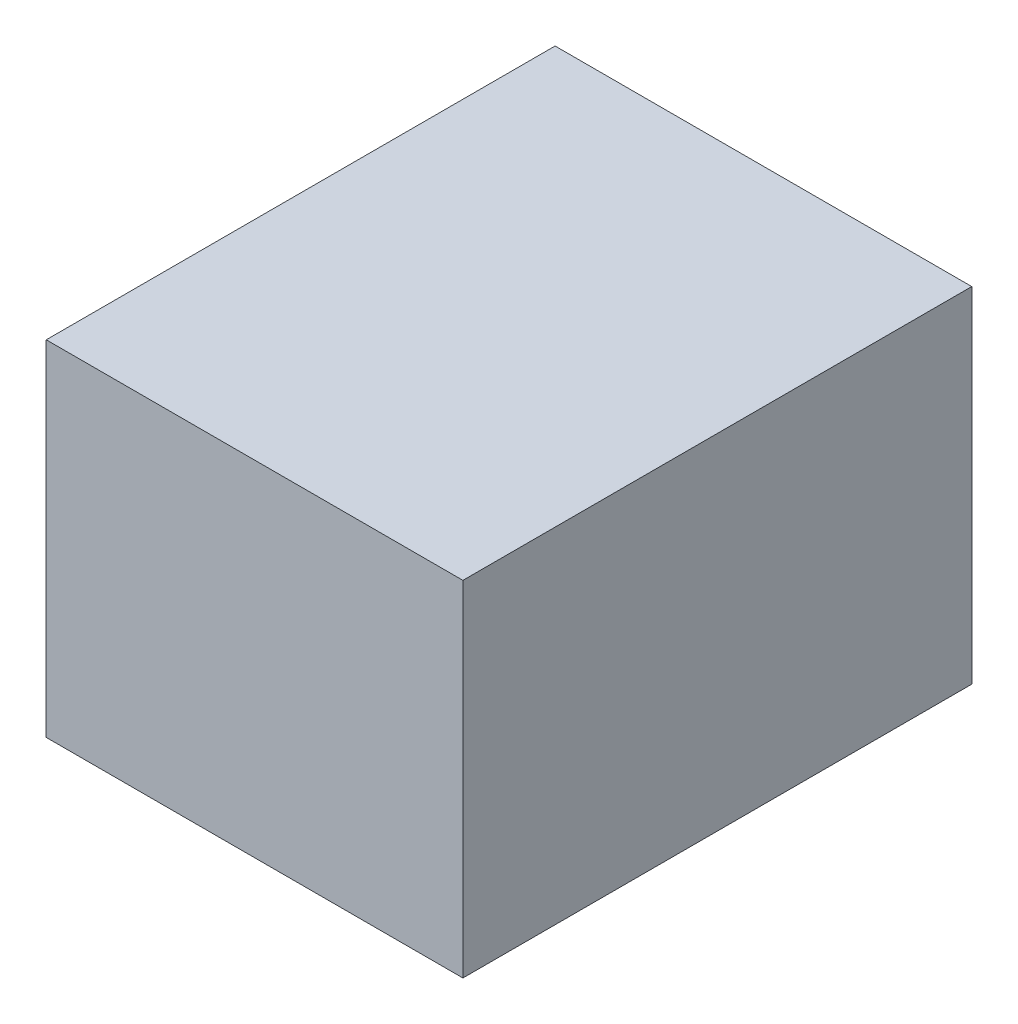
ISO-10303-21;
HEADER;
FILE_DESCRIPTION(('STEP AP214'),'2;1');
FILE_NAME('part.step','',(''),(''),'','','');
FILE_SCHEMA(('AUTOMOTIVE_DESIGN { 1 0 10303 214 1 1 1 1 }'));
ENDSEC;
DATA;
#1=APPLICATION_CONTEXT('core data for automotive mechanical design processes');
#2=APPLICATION_PROTOCOL_DEFINITION('international standard','automotive_design',2000,#1);
#3=PRODUCT_CONTEXT('',#1,'mechanical');
#4=PRODUCT('Part','Part','',(#3));
#5=PRODUCT_RELATED_PRODUCT_CATEGORY('part','',(#4));
#6=PRODUCT_DEFINITION_FORMATION('','',#4);
#7=PRODUCT_DEFINITION_CONTEXT('part definition',#1,'design');
#8=PRODUCT_DEFINITION('design','',#6,#7);
#9=PRODUCT_DEFINITION_SHAPE('','',#8);
#10=(LENGTH_UNIT() NAMED_UNIT(*) SI_UNIT(.MILLI.,.METRE.));
#11=(NAMED_UNIT(*) PLANE_ANGLE_UNIT() SI_UNIT($,.RADIAN.));
#12=(NAMED_UNIT(*) SI_UNIT($,.STERADIAN.) SOLID_ANGLE_UNIT());
#13=UNCERTAINTY_MEASURE_WITH_UNIT(LENGTH_MEASURE(1.E-05),#10,'distance_accuracy_value','');
#14=(GEOMETRIC_REPRESENTATION_CONTEXT(3) GLOBAL_UNCERTAINTY_ASSIGNED_CONTEXT((#13)) GLOBAL_UNIT_ASSIGNED_CONTEXT((#10,
#11,#12)) REPRESENTATION_CONTEXT('',''));
#15=CARTESIAN_POINT('',(0.,0.,0.));
#16=DIRECTION('',(0.,0.,1.));
#17=DIRECTION('',(1.,0.,0.));
#18=AXIS2_PLACEMENT_3D('',#15,#16,#17);
#19=CARTESIAN_POINT('',(0.,0.315,0.));
#20=DIRECTION('',(0.,1.,0.));
#21=DIRECTION('',(1.,0.,0.));
#22=AXIS2_PLACEMENT_3D('',#19,#20,#21);
#23=PLANE('',#22);
#24=DIRECTION('',(0.,0.,1.));
#25=VECTOR('',#24,1.);
#26=CARTESIAN_POINT('',(-0.541350300498,0.315,0.22545647809));
#27=LINE('',#26,#25);
#28=CARTESIAN_POINT('',(-0.541350300498,0.315,0.22545647809));
#29=VERTEX_POINT('',#28);
#30=CARTESIAN_POINT('',(-0.541350300498,0.315,0.37321326599));
#31=VERTEX_POINT('',#30);
#32=EDGE_CURVE('E107',#29,#31,#27,.T.);
#33=ORIENTED_EDGE('',*,*,#32,.F.);
#34=DIRECTION('',(-1.,0.,0.));
#35=VECTOR('',#34,1.);
#36=CARTESIAN_POINT('',(-0.541350300498,0.315,0.22545647809));
#37=LINE('',#36,#35);
#38=CARTESIAN_POINT('',(-0.420364737842,0.315,0.22545647809));
#39=VERTEX_POINT('',#38);
#40=EDGE_CURVE('E27',#39,#29,#37,.T.);
#41=ORIENTED_EDGE('',*,*,#40,.F.);
#42=DIRECTION('',(0.,0.,-1.));
#43=VECTOR('',#42,1.);
#44=CARTESIAN_POINT('',(-0.420364737842,0.315,0.22545647809));
#45=LINE('',#44,#43);
#46=CARTESIAN_POINT('',(-0.420364737842,0.315,0.37321326599));
#47=VERTEX_POINT('',#46);
#48=EDGE_CURVE('E20',#47,#39,#45,.T.);
#49=ORIENTED_EDGE('',*,*,#48,.F.);
#50=DIRECTION('',(1.,0.,0.));
#51=VECTOR('',#50,1.);
#52=CARTESIAN_POINT('',(-0.541350300498,0.315,0.37321326599));
#53=LINE('',#52,#51);
#54=EDGE_CURVE('E73',#31,#47,#53,.T.);
#55=ORIENTED_EDGE('',*,*,#54,.F.);
#56=EDGE_LOOP('',(#33,#41,#49,#55));
#57=FACE_BOUND('',#56,.T.);
#58=ADVANCED_FACE('F17',(#57),#23,.F.);
#59=CARTESIAN_POINT('',(0.,0.415,0.));
#60=DIRECTION('',(0.,1.,0.));
#61=DIRECTION('',(1.,0.,0.));
#62=AXIS2_PLACEMENT_3D('',#59,#60,#61);
#63=PLANE('',#62);
#64=DIRECTION('',(0.,0.,1.));
#65=VECTOR('',#64,1.);
#66=CARTESIAN_POINT('',(-0.541350300498,0.415,0.22545647809));
#67=LINE('',#66,#65);
#68=CARTESIAN_POINT('',(-0.541350300498,0.415,0.22545647809));
#69=VERTEX_POINT('',#68);
#70=CARTESIAN_POINT('',(-0.541350300498,0.415,0.37321326599));
#71=VERTEX_POINT('',#70);
#72=EDGE_CURVE('E90',#69,#71,#67,.T.);
#73=ORIENTED_EDGE('',*,*,#72,.T.);
#74=DIRECTION('',(1.,0.,0.));
#75=VECTOR('',#74,1.);
#76=CARTESIAN_POINT('',(-0.541350300498,0.415,0.37321326599));
#77=LINE('',#76,#75);
#78=CARTESIAN_POINT('',(-0.420364737842,0.415,0.37321326599));
#79=VERTEX_POINT('',#78);
#80=EDGE_CURVE('E62',#71,#79,#77,.T.);
#81=ORIENTED_EDGE('',*,*,#80,.T.);
#82=DIRECTION('',(0.,0.,-1.));
#83=VECTOR('',#82,1.);
#84=CARTESIAN_POINT('',(-0.420364737842,0.415,0.22545647809));
#85=LINE('',#84,#83);
#86=CARTESIAN_POINT('',(-0.420364737842,0.415,0.22545647809));
#87=VERTEX_POINT('',#86);
#88=EDGE_CURVE('E82',#79,#87,#85,.T.);
#89=ORIENTED_EDGE('',*,*,#88,.T.);
#90=DIRECTION('',(-1.,0.,0.));
#91=VECTOR('',#90,1.);
#92=CARTESIAN_POINT('',(-0.541350300498,0.415,0.22545647809));
#93=LINE('',#92,#91);
#94=EDGE_CURVE('E11',#87,#69,#93,.T.);
#95=ORIENTED_EDGE('',*,*,#94,.T.);
#96=EDGE_LOOP('',(#73,#81,#89,#95));
#97=FACE_BOUND('',#96,.T.);
#98=ADVANCED_FACE('F88',(#97),#63,.T.);
#99=CARTESIAN_POINT('',(-0.541350300498,0.415,0.22545647809));
#100=DIRECTION('',(0.,0.,1.));
#101=DIRECTION('',(1.,0.,0.));
#102=AXIS2_PLACEMENT_3D('',#99,#100,#101);
#103=PLANE('',#102);
#104=ORIENTED_EDGE('',*,*,#40,.T.);
#105=DIRECTION('',(0.,-1.,0.));
#106=VECTOR('',#105,1.);
#107=CARTESIAN_POINT('',(-0.541350300498,0.415,0.22545647809));
#108=LINE('',#107,#106);
#109=EDGE_CURVE('E100',#69,#29,#108,.T.);
#110=ORIENTED_EDGE('',*,*,#109,.F.);
#111=ORIENTED_EDGE('',*,*,#94,.F.);
#112=DIRECTION('',(0.,-1.,0.));
#113=VECTOR('',#112,1.);
#114=CARTESIAN_POINT('',(-0.420364737842,0.415,0.22545647809));
#115=LINE('',#114,#113);
#116=EDGE_CURVE('E86',#87,#39,#115,.T.);
#117=ORIENTED_EDGE('',*,*,#116,.T.);
#118=EDGE_LOOP('',(#104,#110,#111,#117));
#119=FACE_BOUND('',#118,.T.);
#120=ADVANCED_FACE('F143',(#119),#103,.F.);
#121=CARTESIAN_POINT('',(-0.420364737842,0.415,0.22545647809));
#122=DIRECTION('',(-1.,0.,0.));
#123=DIRECTION('',(0.,0.,1.));
#124=AXIS2_PLACEMENT_3D('',#121,#122,#123);
#125=PLANE('',#124);
#126=ORIENTED_EDGE('',*,*,#48,.T.);
#127=ORIENTED_EDGE('',*,*,#116,.F.);
#128=ORIENTED_EDGE('',*,*,#88,.F.);
#129=DIRECTION('',(0.,-1.,0.));
#130=VECTOR('',#129,1.);
#131=CARTESIAN_POINT('',(-0.420364737842,0.415,0.37321326599));
#132=LINE('',#131,#130);
#133=EDGE_CURVE('E85',#79,#47,#132,.T.);
#134=ORIENTED_EDGE('',*,*,#133,.T.);
#135=EDGE_LOOP('',(#126,#127,#128,#134));
#136=FACE_BOUND('',#135,.T.);
#137=ADVANCED_FACE('F84',(#136),#125,.F.);
#138=CARTESIAN_POINT('',(-0.541350300498,0.415,0.37321326599));
#139=DIRECTION('',(0.,0.,-1.));
#140=DIRECTION('',(0.,-1.,0.));
#141=AXIS2_PLACEMENT_3D('',#138,#139,#140);
#142=PLANE('',#141);
#143=ORIENTED_EDGE('',*,*,#54,.T.);
#144=ORIENTED_EDGE('',*,*,#133,.F.);
#145=ORIENTED_EDGE('',*,*,#80,.F.);
#146=DIRECTION('',(0.,-1.,0.));
#147=VECTOR('',#146,1.);
#148=CARTESIAN_POINT('',(-0.541350300498,0.415,0.37321326599));
#149=LINE('',#148,#147);
#150=EDGE_CURVE('E111',#71,#31,#149,.T.);
#151=ORIENTED_EDGE('',*,*,#150,.T.);
#152=EDGE_LOOP('',(#143,#144,#145,#151));
#153=FACE_BOUND('',#152,.T.);
#154=ADVANCED_FACE('F94',(#153),#142,.F.);
#155=CARTESIAN_POINT('',(-0.541350300498,0.415,0.22545647809));
#156=DIRECTION('',(1.,0.,0.));
#157=DIRECTION('',(0.,1.,0.));
#158=AXIS2_PLACEMENT_3D('',#155,#156,#157);
#159=PLANE('',#158);
#160=ORIENTED_EDGE('',*,*,#32,.T.);
#161=ORIENTED_EDGE('',*,*,#150,.F.);
#162=ORIENTED_EDGE('',*,*,#72,.F.);
#163=ORIENTED_EDGE('',*,*,#109,.T.);
#164=EDGE_LOOP('',(#160,#161,#162,#163));
#165=FACE_BOUND('',#164,.T.);
#166=ADVANCED_FACE('F125',(#165),#159,.F.);
#167=CLOSED_SHELL('',(#58,#98,#120,#137,#154,#166));
#168=MANIFOLD_SOLID_BREP('B1',#167);
#169=ADVANCED_BREP_SHAPE_REPRESENTATION('',(#18,#168),#14);
#170=SHAPE_DEFINITION_REPRESENTATION(#9,#169);
ENDSEC;
END-ISO-10303-21;
